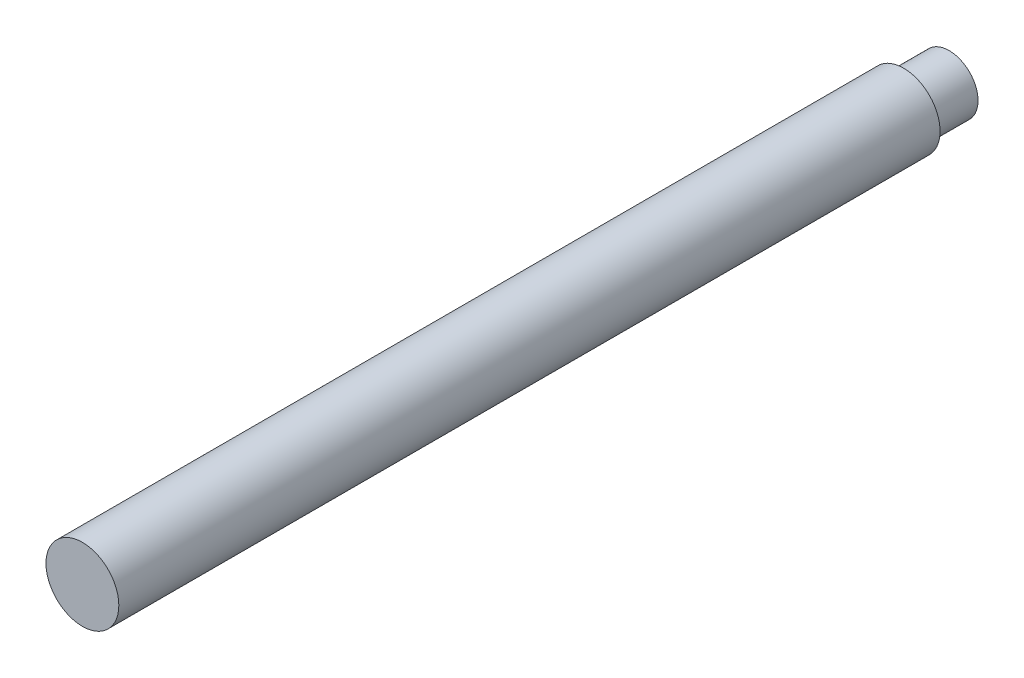
ISO-10303-21;
HEADER;
FILE_DESCRIPTION(('STEP AP214'),'2;1');
FILE_NAME('part.step','',(''),(''),'','','');
FILE_SCHEMA(('AUTOMOTIVE_DESIGN { 1 0 10303 214 1 1 1 1 }'));
ENDSEC;
DATA;
#1=APPLICATION_CONTEXT('core data for automotive mechanical design processes');
#2=APPLICATION_PROTOCOL_DEFINITION('international standard','automotive_design',2000,#1);
#3=PRODUCT_CONTEXT('',#1,'mechanical');
#4=PRODUCT('Part','Part','',(#3));
#5=PRODUCT_RELATED_PRODUCT_CATEGORY('part','',(#4));
#6=PRODUCT_DEFINITION_FORMATION('','',#4);
#7=PRODUCT_DEFINITION_CONTEXT('part definition',#1,'design');
#8=PRODUCT_DEFINITION('design','',#6,#7);
#9=PRODUCT_DEFINITION_SHAPE('','',#8);
#10=(LENGTH_UNIT() NAMED_UNIT(*) SI_UNIT(.MILLI.,.METRE.));
#11=(NAMED_UNIT(*) PLANE_ANGLE_UNIT() SI_UNIT($,.RADIAN.));
#12=(NAMED_UNIT(*) SI_UNIT($,.STERADIAN.) SOLID_ANGLE_UNIT());
#13=UNCERTAINTY_MEASURE_WITH_UNIT(LENGTH_MEASURE(1.E-05),#10,'distance_accuracy_value','');
#14=(GEOMETRIC_REPRESENTATION_CONTEXT(3) GLOBAL_UNCERTAINTY_ASSIGNED_CONTEXT((#13)) GLOBAL_UNIT_ASSIGNED_CONTEXT((#10,
#11,#12)) REPRESENTATION_CONTEXT('',''));
#15=CARTESIAN_POINT('',(0.,0.,0.));
#16=DIRECTION('',(0.,0.,1.));
#17=DIRECTION('',(1.,0.,0.));
#18=AXIS2_PLACEMENT_3D('',#15,#16,#17);
#19=CARTESIAN_POINT('',(0.,0.,95.25));
#20=DIRECTION('',(0.,0.,-1.));
#21=DIRECTION('',(-1.,0.,0.));
#22=AXIS2_PLACEMENT_3D('',#19,#20,#21);
#23=CYLINDRICAL_SURFACE('',#22,4.0005);
#24=CARTESIAN_POINT('',(0.,0.,95.25));
#25=DIRECTION('',(0.,0.,1.));
#26=DIRECTION('',(1.,0.,0.));
#27=AXIS2_PLACEMENT_3D('',#24,#25,#26);
#28=CIRCLE('',#27,4.0005);
#29=CARTESIAN_POINT('',(4.0005,0.,95.25));
#30=VERTEX_POINT('',#29);
#31=EDGE_CURVE('E10',#30,#30,#28,.T.);
#32=ORIENTED_EDGE('',*,*,#31,.F.);
#33=EDGE_LOOP('',(#32));
#34=FACE_BOUND('',#33,.T.);
#35=CARTESIAN_POINT('',(0.,0.,5.));
#36=DIRECTION('',(0.,0.,-1.));
#37=DIRECTION('',(-1.,0.,0.));
#38=AXIS2_PLACEMENT_3D('',#35,#36,#37);
#39=CIRCLE('',#38,4.0005);
#40=CARTESIAN_POINT('',(-4.0005,0.,5.));
#41=VERTEX_POINT('',#40);
#42=EDGE_CURVE('E34',#41,#41,#39,.T.);
#43=ORIENTED_EDGE('',*,*,#42,.F.);
#44=EDGE_LOOP('',(#43));
#45=FACE_BOUND('',#44,.T.);
#46=ADVANCED_FACE('F31',(#34,#45),#23,.T.);
#47=CARTESIAN_POINT('',(0.,0.,95.25));
#48=DIRECTION('',(0.,0.,1.));
#49=DIRECTION('',(1.,0.,0.));
#50=AXIS2_PLACEMENT_3D('',#47,#48,#49);
#51=PLANE('',#50);
#52=ORIENTED_EDGE('',*,*,#31,.T.);
#53=EDGE_LOOP('',(#52));
#54=FACE_BOUND('',#53,.T.);
#55=ADVANCED_FACE('F55',(#54),#51,.T.);
#56=CARTESIAN_POINT('',(0.,0.,5.));
#57=DIRECTION('',(0.,0.,-1.));
#58=DIRECTION('',(-1.,0.,0.));
#59=AXIS2_PLACEMENT_3D('',#56,#57,#58);
#60=PLANE('',#59);
#61=CARTESIAN_POINT('',(0.,0.,5.));
#62=DIRECTION('',(0.,0.,-1.));
#63=DIRECTION('',(-1.,0.,0.));
#64=AXIS2_PLACEMENT_3D('',#61,#62,#63);
#65=CIRCLE('',#64,3.175);
#66=CARTESIAN_POINT('',(-3.175,0.,5.));
#67=VERTEX_POINT('',#66);
#68=EDGE_CURVE('E41',#67,#67,#65,.T.);
#69=ORIENTED_EDGE('',*,*,#68,.F.);
#70=EDGE_LOOP('',(#69));
#71=FACE_BOUND('',#70,.T.);
#72=ORIENTED_EDGE('',*,*,#42,.T.);
#73=EDGE_LOOP('',(#72));
#74=FACE_BOUND('',#73,.T.);
#75=ADVANCED_FACE('F52',(#71,#74),#60,.T.);
#76=CARTESIAN_POINT('',(0.,0.,5.));
#77=DIRECTION('',(0.,0.,-1.));
#78=DIRECTION('',(-1.,0.,0.));
#79=AXIS2_PLACEMENT_3D('',#76,#77,#78);
#80=CYLINDRICAL_SURFACE('',#79,3.175);
#81=ORIENTED_EDGE('',*,*,#68,.T.);
#82=EDGE_LOOP('',(#81));
#83=FACE_BOUND('',#82,.T.);
#84=CARTESIAN_POINT('',(0.,0.,0.));
#85=DIRECTION('',(0.,0.,-1.));
#86=DIRECTION('',(-1.,0.,0.));
#87=AXIS2_PLACEMENT_3D('',#84,#85,#86);
#88=CIRCLE('',#87,3.175);
#89=CARTESIAN_POINT('',(-3.175,0.,0.));
#90=VERTEX_POINT('',#89);
#91=EDGE_CURVE('E43',#90,#90,#88,.T.);
#92=ORIENTED_EDGE('',*,*,#91,.F.);
#93=EDGE_LOOP('',(#92));
#94=FACE_BOUND('',#93,.T.);
#95=ADVANCED_FACE('F49',(#83,#94),#80,.T.);
#96=CARTESIAN_POINT('',(0.,0.,0.));
#97=DIRECTION('',(0.,0.,1.));
#98=DIRECTION('',(1.,0.,0.));
#99=AXIS2_PLACEMENT_3D('',#96,#97,#98);
#100=PLANE('',#99);
#101=ORIENTED_EDGE('',*,*,#91,.T.);
#102=EDGE_LOOP('',(#101));
#103=FACE_BOUND('',#102,.T.);
#104=ADVANCED_FACE('F68',(#103),#100,.F.);
#105=CLOSED_SHELL('',(#46,#55,#75,#95,#104));
#106=MANIFOLD_SOLID_BREP('B2',#105);
#107=ADVANCED_BREP_SHAPE_REPRESENTATION('',(#18,#106),#14);
#108=SHAPE_DEFINITION_REPRESENTATION(#9,#107);
ENDSEC;
END-ISO-10303-21;
